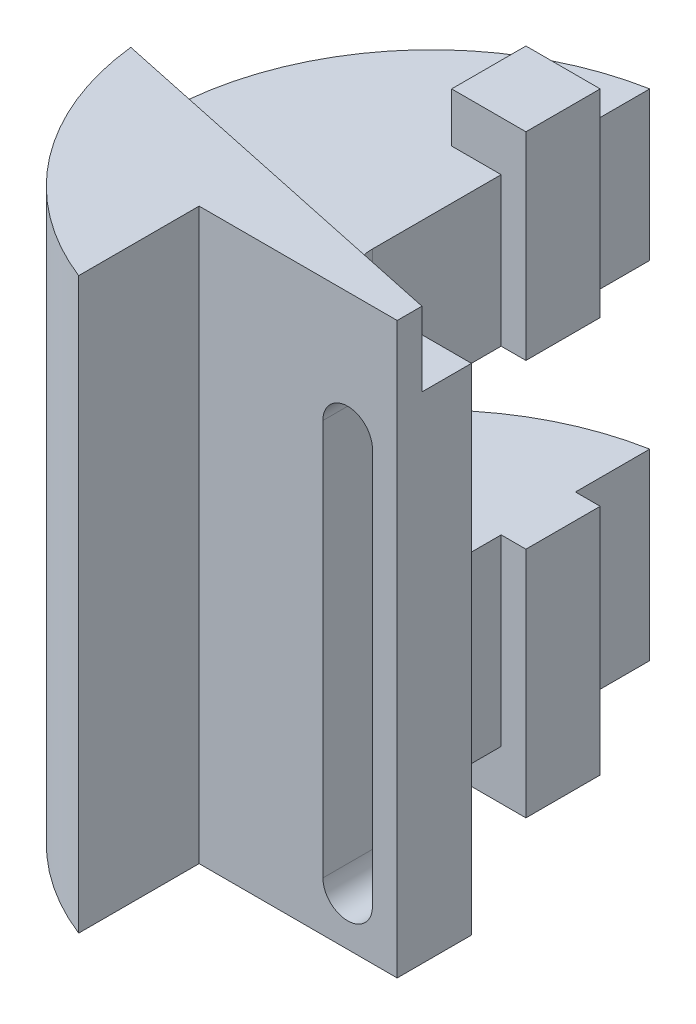
ISO-10303-21;
HEADER;
FILE_DESCRIPTION(('STEP AP214'),'2;1');
FILE_NAME('part.step','',(''),(''),'','','');
FILE_SCHEMA(('AUTOMOTIVE_DESIGN { 1 0 10303 214 1 1 1 1 }'));
ENDSEC;
DATA;
#1=APPLICATION_CONTEXT('core data for automotive mechanical design processes');
#2=APPLICATION_PROTOCOL_DEFINITION('international standard','automotive_design',2000,#1);
#3=PRODUCT_CONTEXT('',#1,'mechanical');
#4=PRODUCT('Part','Part','',(#3));
#5=PRODUCT_RELATED_PRODUCT_CATEGORY('part','',(#4));
#6=PRODUCT_DEFINITION_FORMATION('','',#4);
#7=PRODUCT_DEFINITION_CONTEXT('part definition',#1,'design');
#8=PRODUCT_DEFINITION('design','',#6,#7);
#9=PRODUCT_DEFINITION_SHAPE('','',#8);
#10=(LENGTH_UNIT() NAMED_UNIT(*) SI_UNIT(.MILLI.,.METRE.));
#11=(NAMED_UNIT(*) PLANE_ANGLE_UNIT() SI_UNIT($,.RADIAN.));
#12=(NAMED_UNIT(*) SI_UNIT($,.STERADIAN.) SOLID_ANGLE_UNIT());
#13=UNCERTAINTY_MEASURE_WITH_UNIT(LENGTH_MEASURE(1.E-05),#10,'distance_accuracy_value','');
#14=(GEOMETRIC_REPRESENTATION_CONTEXT(3) GLOBAL_UNCERTAINTY_ASSIGNED_CONTEXT((#13)) GLOBAL_UNIT_ASSIGNED_CONTEXT((#10,
#11,#12)) REPRESENTATION_CONTEXT('',''));
#15=CARTESIAN_POINT('',(0.,0.,0.));
#16=DIRECTION('',(0.,0.,1.));
#17=DIRECTION('',(1.,0.,0.));
#18=AXIS2_PLACEMENT_3D('',#15,#16,#17);
#19=CARTESIAN_POINT('',(0.,50.,0.));
#20=DIRECTION('',(0.,1.,0.));
#21=DIRECTION('',(0.,0.,1.));
#22=AXIS2_PLACEMENT_3D('',#19,#20,#21);
#23=PLANE('',#22);
#24=CARTESIAN_POINT('',(-20.,50.,-26.9167308680402));
#25=DIRECTION('',(0.,1.,0.));
#26=DIRECTION('',(0.,0.,1.));
#27=AXIS2_PLACEMENT_3D('',#24,#25,#26);
#28=CIRCLE('',#27,55.);
#29=CARTESIAN_POINT('',(-74.6666981663272,50.,-20.8708966334882));
#30=VERTEX_POINT('',#29);
#31=CARTESIAN_POINT('',(-30.,50.,-81.));
#32=VERTEX_POINT('',#31);
#33=EDGE_CURVE('E363',#30,#32,#28,.F.);
#34=ORIENTED_EDGE('',*,*,#33,.F.);
#35=DIRECTION('',(-0.978147600733805,0.,-0.207911690817763));
#36=VECTOR('',#35,1.);
#37=CARTESIAN_POINT('',(0.,50.,-5.));
#38=LINE('',#37,#36);
#39=CARTESIAN_POINT('',(0.,50.,-5.));
#40=VERTEX_POINT('',#39);
#41=EDGE_CURVE('E260',#40,#30,#38,.T.);
#42=ORIENTED_EDGE('',*,*,#41,.F.);
#43=DIRECTION('',(0.,0.,1.));
#44=VECTOR('',#43,1.);
#45=CARTESIAN_POINT('',(0.,50.,0.));
#46=LINE('',#45,#44);
#47=CARTESIAN_POINT('',(0.,50.,-15.));
#48=VERTEX_POINT('',#47);
#49=EDGE_CURVE('E365',#48,#40,#46,.T.);
#50=ORIENTED_EDGE('',*,*,#49,.F.);
#51=DIRECTION('',(1.,0.,0.));
#52=VECTOR('',#51,1.);
#53=CARTESIAN_POINT('',(0.,50.,-15.));
#54=LINE('',#53,#52);
#55=CARTESIAN_POINT('',(-19.9999999999999,50.,-15.));
#56=VERTEX_POINT('',#55);
#57=EDGE_CURVE('E368',#56,#48,#54,.T.);
#58=ORIENTED_EDGE('',*,*,#57,.F.);
#59=CARTESIAN_POINT('',(-20.,50.,-25.));
#60=DIRECTION('',(0.,1.,0.));
#61=DIRECTION('',(0.,0.,1.));
#62=AXIS2_PLACEMENT_3D('',#59,#60,#61);
#63=CIRCLE('',#62,10.);
#64=CARTESIAN_POINT('',(-30.,50.,-25.0000000000001));
#65=VERTEX_POINT('',#64);
#66=EDGE_CURVE('E348',#65,#56,#63,.T.);
#67=ORIENTED_EDGE('',*,*,#66,.F.);
#68=DIRECTION('',(0.,0.,1.));
#69=VECTOR('',#68,1.);
#70=CARTESIAN_POINT('',(-30.,50.,0.));
#71=LINE('',#70,#69);
#72=CARTESIAN_POINT('',(-30.,50.,-51.));
#73=VERTEX_POINT('',#72);
#74=EDGE_CURVE('E351',#73,#65,#71,.T.);
#75=ORIENTED_EDGE('',*,*,#74,.F.);
#76=DIRECTION('',(1.,0.,0.));
#77=VECTOR('',#76,1.);
#78=CARTESIAN_POINT('',(0.,50.,-51.));
#79=LINE('',#78,#77);
#80=CARTESIAN_POINT('',(-40.,50.,-51.));
#81=VERTEX_POINT('',#80);
#82=EDGE_CURVE('E355',#81,#73,#79,.T.);
#83=ORIENTED_EDGE('',*,*,#82,.F.);
#84=DIRECTION('',(0.,0.,1.));
#85=VECTOR('',#84,1.);
#86=CARTESIAN_POINT('',(-40.,50.,0.));
#87=LINE('',#86,#85);
#88=CARTESIAN_POINT('',(-40.,50.,-66.));
#89=VERTEX_POINT('',#88);
#90=EDGE_CURVE('E358',#89,#81,#87,.T.);
#91=ORIENTED_EDGE('',*,*,#90,.F.);
#92=DIRECTION('',(1.,0.,0.));
#93=VECTOR('',#92,1.);
#94=CARTESIAN_POINT('',(0.,50.,-66.));
#95=LINE('',#94,#93);
#96=CARTESIAN_POINT('',(-30.,50.,-66.));
#97=VERTEX_POINT('',#96);
#98=EDGE_CURVE('E360',#89,#97,#95,.T.);
#99=ORIENTED_EDGE('',*,*,#98,.T.);
#100=EDGE_CURVE('E356',#32,#97,#71,.T.);
#101=ORIENTED_EDGE('',*,*,#100,.F.);
#102=EDGE_LOOP('',(#34,#42,#50,#58,#67,#75,#83,#91,#99,#101));
#103=FACE_BOUND('',#102,.T.);
#104=ADVANCED_FACE('F41',(#103),#23,.T.);
#105=CARTESIAN_POINT('',(-30.,50.,0.));
#106=DIRECTION('',(1.,0.,0.));
#107=DIRECTION('',(0.,0.,-1.));
#108=AXIS2_PLACEMENT_3D('',#105,#106,#107);
#109=PLANE('',#108);
#110=DIRECTION('',(0.,0.,1.));
#111=VECTOR('',#110,1.);
#112=CARTESIAN_POINT('',(-30.,20.,0.));
#113=LINE('',#112,#111);
#114=CARTESIAN_POINT('',(-30.,20.,-81.));
#115=VERTEX_POINT('',#114);
#116=CARTESIAN_POINT('',(-30.,20.,-66.));
#117=VERTEX_POINT('',#116);
#118=EDGE_CURVE('E303',#115,#117,#113,.T.);
#119=ORIENTED_EDGE('',*,*,#118,.F.);
#120=DIRECTION('',(0.,-1.,0.));
#121=VECTOR('',#120,1.);
#122=CARTESIAN_POINT('',(-30.,50.,-81.));
#123=LINE('',#122,#121);
#124=EDGE_CURVE('E411',#32,#115,#123,.T.);
#125=ORIENTED_EDGE('',*,*,#124,.F.);
#126=ORIENTED_EDGE('',*,*,#100,.T.);
#127=DIRECTION('',(0.,-1.,0.));
#128=VECTOR('',#127,1.);
#129=CARTESIAN_POINT('',(-30.,50.,-66.));
#130=LINE('',#129,#128);
#131=EDGE_CURVE('E415',#97,#117,#130,.T.);
#132=ORIENTED_EDGE('',*,*,#131,.T.);
#133=EDGE_LOOP('',(#119,#125,#126,#132));
#134=FACE_BOUND('',#133,.T.);
#135=ADVANCED_FACE('F475',(#134),#109,.T.);
#136=CARTESIAN_POINT('',(-25.,60.,0.));
#137=DIRECTION('',(1.,0.,0.));
#138=DIRECTION('',(0.,0.,-1.));
#139=AXIS2_PLACEMENT_3D('',#136,#137,#138);
#140=PLANE('',#139);
#141=DIRECTION('',(0.,0.,1.));
#142=VECTOR('',#141,1.);
#143=CARTESIAN_POINT('',(-25.,20.,0.));
#144=LINE('',#143,#142);
#145=CARTESIAN_POINT('',(-25.,20.,-66.));
#146=VERTEX_POINT('',#145);
#147=CARTESIAN_POINT('',(-25.,20.,-51.));
#148=VERTEX_POINT('',#147);
#149=EDGE_CURVE('E297',#146,#148,#144,.T.);
#150=ORIENTED_EDGE('',*,*,#149,.F.);
#151=DIRECTION('',(0.,-1.,0.));
#152=VECTOR('',#151,1.);
#153=CARTESIAN_POINT('',(-25.,60.,-66.));
#154=LINE('',#153,#152);
#155=CARTESIAN_POINT('',(-25.,60.,-66.));
#156=VERTEX_POINT('',#155);
#157=EDGE_CURVE('E344',#156,#146,#154,.T.);
#158=ORIENTED_EDGE('',*,*,#157,.F.);
#159=DIRECTION('',(0.,0.,1.));
#160=VECTOR('',#159,1.);
#161=CARTESIAN_POINT('',(-25.,60.,0.));
#162=LINE('',#161,#160);
#163=CARTESIAN_POINT('',(-25.,60.,-51.));
#164=VERTEX_POINT('',#163);
#165=EDGE_CURVE('E310',#156,#164,#162,.T.);
#166=ORIENTED_EDGE('',*,*,#165,.T.);
#167=DIRECTION('',(0.,-1.,0.));
#168=VECTOR('',#167,1.);
#169=CARTESIAN_POINT('',(-25.,60.,-51.));
#170=LINE('',#169,#168);
#171=EDGE_CURVE('E332',#164,#148,#170,.T.);
#172=ORIENTED_EDGE('',*,*,#171,.T.);
#173=EDGE_LOOP('',(#150,#158,#166,#172));
#174=FACE_BOUND('',#173,.T.);
#175=ADVANCED_FACE('F436',(#174),#140,.T.);
#176=CARTESIAN_POINT('',(0.,60.,-66.));
#177=DIRECTION('',(0.,0.,-1.));
#178=DIRECTION('',(-1.,0.,0.));
#179=AXIS2_PLACEMENT_3D('',#176,#177,#178);
#180=PLANE('',#179);
#181=DIRECTION('',(1.,0.,0.));
#182=VECTOR('',#181,1.);
#183=CARTESIAN_POINT('',(0.,20.,-66.));
#184=LINE('',#183,#182);
#185=EDGE_CURVE('E301',#117,#146,#184,.T.);
#186=ORIENTED_EDGE('',*,*,#185,.F.);
#187=ORIENTED_EDGE('',*,*,#131,.F.);
#188=ORIENTED_EDGE('',*,*,#98,.F.);
#189=DIRECTION('',(0.,-1.,0.));
#190=VECTOR('',#189,1.);
#191=CARTESIAN_POINT('',(-40.,60.,-66.));
#192=LINE('',#191,#190);
#193=CARTESIAN_POINT('',(-40.,60.,-66.));
#194=VERTEX_POINT('',#193);
#195=EDGE_CURVE('E340',#194,#89,#192,.T.);
#196=ORIENTED_EDGE('',*,*,#195,.F.);
#197=DIRECTION('',(1.,0.,0.));
#198=VECTOR('',#197,1.);
#199=CARTESIAN_POINT('',(0.,60.,-66.));
#200=LINE('',#199,#198);
#201=EDGE_CURVE('E313',#194,#156,#200,.T.);
#202=ORIENTED_EDGE('',*,*,#201,.T.);
#203=ORIENTED_EDGE('',*,*,#157,.T.);
#204=EDGE_LOOP('',(#186,#187,#188,#196,#202,#203));
#205=FACE_BOUND('',#204,.T.);
#206=ADVANCED_FACE('F443',(#205),#180,.T.);
#207=CARTESIAN_POINT('',(0.,60.,-51.));
#208=DIRECTION('',(0.,0.,-1.));
#209=DIRECTION('',(-1.,0.,0.));
#210=AXIS2_PLACEMENT_3D('',#207,#208,#209);
#211=PLANE('',#210);
#212=DIRECTION('',(0.,-1.,0.));
#213=VECTOR('',#212,1.);
#214=CARTESIAN_POINT('',(-30.,50.,-51.));
#215=LINE('',#214,#213);
#216=CARTESIAN_POINT('',(-30.,20.,-51.));
#217=VERTEX_POINT('',#216);
#218=EDGE_CURVE('E419',#73,#217,#215,.T.);
#219=ORIENTED_EDGE('',*,*,#218,.T.);
#220=DIRECTION('',(1.,0.,0.));
#221=VECTOR('',#220,1.);
#222=CARTESIAN_POINT('',(0.,20.,-51.));
#223=LINE('',#222,#221);
#224=EDGE_CURVE('E49',#217,#148,#223,.T.);
#225=ORIENTED_EDGE('',*,*,#224,.T.);
#226=ORIENTED_EDGE('',*,*,#171,.F.);
#227=DIRECTION('',(1.,0.,0.));
#228=VECTOR('',#227,1.);
#229=CARTESIAN_POINT('',(0.,60.,-51.));
#230=LINE('',#229,#228);
#231=CARTESIAN_POINT('',(-40.,60.,-51.));
#232=VERTEX_POINT('',#231);
#233=EDGE_CURVE('E319',#232,#164,#230,.T.);
#234=ORIENTED_EDGE('',*,*,#233,.F.);
#235=DIRECTION('',(0.,-1.,0.));
#236=VECTOR('',#235,1.);
#237=CARTESIAN_POINT('',(-40.,60.,-51.));
#238=LINE('',#237,#236);
#239=EDGE_CURVE('E336',#232,#81,#238,.T.);
#240=ORIENTED_EDGE('',*,*,#239,.T.);
#241=ORIENTED_EDGE('',*,*,#82,.T.);
#242=EDGE_LOOP('',(#219,#225,#226,#234,#240,#241));
#243=FACE_BOUND('',#242,.T.);
#244=ADVANCED_FACE('F429',(#243),#211,.F.);
#245=CARTESIAN_POINT('',(-20.,50.,-25.));
#246=DIRECTION('',(0.,-1.,0.));
#247=DIRECTION('',(0.,0.,-1.));
#248=AXIS2_PLACEMENT_3D('',#245,#246,#247);
#249=CYLINDRICAL_SURFACE('',#248,10.);
#250=CARTESIAN_POINT('',(-20.,-50.,-25.));
#251=DIRECTION('',(0.,1.,0.));
#252=DIRECTION('',(0.,0.,1.));
#253=AXIS2_PLACEMENT_3D('',#250,#251,#252);
#254=CIRCLE('',#253,10.);
#255=CARTESIAN_POINT('',(-30.,-50.,-25.0000000000001));
#256=VERTEX_POINT('',#255);
#257=CARTESIAN_POINT('',(-19.9999999999999,-50.,-15.));
#258=VERTEX_POINT('',#257);
#259=EDGE_CURVE('E347',#256,#258,#254,.T.);
#260=ORIENTED_EDGE('',*,*,#259,.F.);
#261=DIRECTION('',(0.,-1.,0.));
#262=VECTOR('',#261,1.);
#263=CARTESIAN_POINT('',(-30.,50.,-25.0000000000001));
#264=LINE('',#263,#262);
#265=EDGE_CURVE('E422',#65,#256,#264,.T.);
#266=ORIENTED_EDGE('',*,*,#265,.F.);
#267=ORIENTED_EDGE('',*,*,#66,.T.);
#268=DIRECTION('',(0.,-1.,0.));
#269=VECTOR('',#268,1.);
#270=CARTESIAN_POINT('',(-19.9999999999999,50.,-15.));
#271=LINE('',#270,#269);
#272=EDGE_CURVE('E371',#56,#258,#271,.T.);
#273=ORIENTED_EDGE('',*,*,#272,.T.);
#274=EDGE_LOOP('',(#260,#266,#267,#273));
#275=FACE_BOUND('',#274,.T.);
#276=ADVANCED_FACE('F43',(#275),#249,.F.);
#277=DIRECTION('',(0.,0.,1.));
#278=VECTOR('',#277,1.);
#279=CARTESIAN_POINT('',(-30.,20.,0.));
#280=LINE('',#279,#278);
#281=CARTESIAN_POINT('',(-30.,20.,-41.));
#282=VERTEX_POINT('',#281);
#283=EDGE_CURVE('E299',#217,#282,#280,.T.);
#284=ORIENTED_EDGE('',*,*,#283,.F.);
#285=ORIENTED_EDGE('',*,*,#218,.F.);
#286=ORIENTED_EDGE('',*,*,#74,.T.);
#287=ORIENTED_EDGE('',*,*,#265,.T.);
#288=DIRECTION('',(0.,0.,1.));
#289=VECTOR('',#288,1.);
#290=CARTESIAN_POINT('',(-30.,-50.,0.));
#291=LINE('',#290,#289);
#292=CARTESIAN_POINT('',(-30.,-50.,-51.));
#293=VERTEX_POINT('',#292);
#294=EDGE_CURVE('E374',#293,#256,#291,.T.);
#295=ORIENTED_EDGE('',*,*,#294,.F.);
#296=CARTESIAN_POINT('',(-30.,-13.,-51.));
#297=VERTEX_POINT('',#296);
#298=EDGE_CURVE('E418',#297,#293,#215,.T.);
#299=ORIENTED_EDGE('',*,*,#298,.F.);
#300=DIRECTION('',(0.,0.,-1.));
#301=VECTOR('',#300,1.);
#302=CARTESIAN_POINT('',(-30.,-13.,0.));
#303=LINE('',#302,#301);
#304=CARTESIAN_POINT('',(-30.,-13.,-41.));
#305=VERTEX_POINT('',#304);
#306=EDGE_CURVE('E289',#305,#297,#303,.T.);
#307=ORIENTED_EDGE('',*,*,#306,.F.);
#308=DIRECTION('',(0.,-1.,0.));
#309=VECTOR('',#308,1.);
#310=CARTESIAN_POINT('',(-30.,50.,-41.));
#311=LINE('',#310,#309);
#312=EDGE_CURVE('E307',#282,#305,#311,.T.);
#313=ORIENTED_EDGE('',*,*,#312,.F.);
#314=EDGE_LOOP('',(#284,#285,#286,#287,#295,#299,#307,#313));
#315=FACE_BOUND('',#314,.T.);
#316=ADVANCED_FACE('F456',(#315),#109,.T.);
#317=DIRECTION('',(0.,0.,-1.));
#318=VECTOR('',#317,1.);
#319=CARTESIAN_POINT('',(-30.,-13.,0.));
#320=LINE('',#319,#318);
#321=CARTESIAN_POINT('',(-30.,-13.,-66.));
#322=VERTEX_POINT('',#321);
#323=CARTESIAN_POINT('',(-30.,-13.,-81.));
#324=VERTEX_POINT('',#323);
#325=EDGE_CURVE('E293',#322,#324,#320,.T.);
#326=ORIENTED_EDGE('',*,*,#325,.F.);
#327=CARTESIAN_POINT('',(-30.,-50.,-66.));
#328=VERTEX_POINT('',#327);
#329=EDGE_CURVE('E414',#322,#328,#130,.T.);
#330=ORIENTED_EDGE('',*,*,#329,.T.);
#331=CARTESIAN_POINT('',(-30.,-50.,-81.));
#332=VERTEX_POINT('',#331);
#333=EDGE_CURVE('E378',#332,#328,#291,.T.);
#334=ORIENTED_EDGE('',*,*,#333,.F.);
#335=EDGE_CURVE('E410',#324,#332,#123,.T.);
#336=ORIENTED_EDGE('',*,*,#335,.F.);
#337=EDGE_LOOP('',(#326,#330,#334,#336));
#338=FACE_BOUND('',#337,.T.);
#339=ADVANCED_FACE('F513',(#338),#109,.T.);
#340=CARTESIAN_POINT('',(-20.,50.,-26.9167308680402));
#341=DIRECTION('',(0.,-1.,0.));
#342=DIRECTION('',(0.,0.,-1.));
#343=AXIS2_PLACEMENT_3D('',#340,#341,#342);
#344=CYLINDRICAL_SURFACE('',#343,55.);
#345=CARTESIAN_POINT('',(-20.,20.,-26.9167308680402));
#346=DIRECTION('',(0.,1.,0.));
#347=DIRECTION('',(0.,0.,1.));
#348=AXIS2_PLACEMENT_3D('',#345,#346,#347);
#349=CIRCLE('',#348,55.);
#350=CARTESIAN_POINT('',(-73.166357130772,20.,-41.));
#351=VERTEX_POINT('',#350);
#352=EDGE_CURVE('E305',#351,#115,#349,.F.);
#353=ORIENTED_EDGE('',*,*,#352,.F.);
#354=DIRECTION('',(0.,-1.,0.));
#355=VECTOR('',#354,1.);
#356=CARTESIAN_POINT('',(-73.166357130772,50.,-41.));
#357=LINE('',#356,#355);
#358=CARTESIAN_POINT('',(-73.166357130772,-13.,-41.));
#359=VERTEX_POINT('',#358);
#360=EDGE_CURVE('E11',#359,#351,#357,.F.);
#361=ORIENTED_EDGE('',*,*,#360,.F.);
#362=CARTESIAN_POINT('',(-20.,-13.,-26.9167308680402));
#363=DIRECTION('',(0.,-1.,0.));
#364=DIRECTION('',(0.,0.,-1.));
#365=AXIS2_PLACEMENT_3D('',#362,#363,#364);
#366=CIRCLE('',#365,55.);
#367=EDGE_CURVE('E295',#324,#359,#366,.F.);
#368=ORIENTED_EDGE('',*,*,#367,.F.);
#369=ORIENTED_EDGE('',*,*,#335,.T.);
#370=CARTESIAN_POINT('',(-20.,-50.,-26.9167308680402));
#371=DIRECTION('',(0.,1.,0.));
#372=DIRECTION('',(0.,0.,1.));
#373=AXIS2_PLACEMENT_3D('',#370,#371,#372);
#374=CIRCLE('',#373,55.);
#375=CARTESIAN_POINT('',(-40.,-50.,24.3180229617578));
#376=VERTEX_POINT('',#375);
#377=EDGE_CURVE('E387',#376,#332,#374,.F.);
#378=ORIENTED_EDGE('',*,*,#377,.F.);
#379=DIRECTION('',(0.,-1.,0.));
#380=VECTOR('',#379,1.);
#381=CARTESIAN_POINT('',(-40.,50.,24.3180229617578));
#382=LINE('',#381,#380);
#383=CARTESIAN_POINT('',(-40.,65.,24.3180229617578));
#384=VERTEX_POINT('',#383);
#385=EDGE_CURVE('E408',#384,#376,#382,.T.);
#386=ORIENTED_EDGE('',*,*,#385,.F.);
#387=CARTESIAN_POINT('',(-19.9999999999968,65.,-26.9167308680426));
#388=DIRECTION('',(0.,1.,0.));
#389=DIRECTION('',(0.,0.,1.));
#390=AXIS2_PLACEMENT_3D('',#387,#388,#389);
#391=CIRCLE('',#390,55.0000000000035);
#392=CARTESIAN_POINT('',(-74.6666981663272,65.,-20.8708966334882));
#393=VERTEX_POINT('',#392);
#394=EDGE_CURVE('E266',#393,#384,#391,.T.);
#395=ORIENTED_EDGE('',*,*,#394,.F.);
#396=DIRECTION('',(0.,-1.,0.));
#397=VECTOR('',#396,1.);
#398=CARTESIAN_POINT('',(-74.6666981663272,65.,-20.8708966334882));
#399=LINE('',#398,#397);
#400=EDGE_CURVE('E275',#393,#30,#399,.T.);
#401=ORIENTED_EDGE('',*,*,#400,.T.);
#402=ORIENTED_EDGE('',*,*,#33,.T.);
#403=ORIENTED_EDGE('',*,*,#124,.T.);
#404=EDGE_LOOP('',(#353,#361,#368,#369,#378,#386,#395,#401,#402,#403));
#405=FACE_BOUND('',#404,.T.);
#406=ADVANCED_FACE('F470',(#405),#344,.T.);
#407=CARTESIAN_POINT('',(-40.,50.,0.));
#408=DIRECTION('',(1.,0.,0.));
#409=DIRECTION('',(0.,0.,-1.));
#410=AXIS2_PLACEMENT_3D('',#407,#408,#409);
#411=PLANE('',#410);
#412=DIRECTION('',(0.,0.,1.));
#413=VECTOR('',#412,1.);
#414=CARTESIAN_POINT('',(-40.,-50.,0.));
#415=LINE('',#414,#413);
#416=CARTESIAN_POINT('',(-40.,-50.,0.));
#417=VERTEX_POINT('',#416);
#418=EDGE_CURVE('E390',#417,#376,#415,.T.);
#419=ORIENTED_EDGE('',*,*,#418,.F.);
#420=DIRECTION('',(0.,-1.,0.));
#421=VECTOR('',#420,1.);
#422=CARTESIAN_POINT('',(-40.,50.,0.));
#423=LINE('',#422,#421);
#424=CARTESIAN_POINT('',(-40.,65.,0.));
#425=VERTEX_POINT('',#424);
#426=EDGE_CURVE('E406',#425,#417,#423,.T.);
#427=ORIENTED_EDGE('',*,*,#426,.F.);
#428=DIRECTION('',(0.,0.,-1.));
#429=VECTOR('',#428,1.);
#430=CARTESIAN_POINT('',(-40.,65.,0.));
#431=LINE('',#430,#429);
#432=EDGE_CURVE('E269',#384,#425,#431,.T.);
#433=ORIENTED_EDGE('',*,*,#432,.F.);
#434=ORIENTED_EDGE('',*,*,#385,.T.);
#435=EDGE_LOOP('',(#419,#427,#433,#434));
#436=FACE_BOUND('',#435,.T.);
#437=ADVANCED_FACE('F520',(#436),#411,.T.);
#438=CARTESIAN_POINT('',(0.,50.,0.));
#439=DIRECTION('',(0.,0.,1.));
#440=DIRECTION('',(1.,0.,0.));
#441=AXIS2_PLACEMENT_3D('',#438,#439,#440);
#442=PLANE('',#441);
#443=CARTESIAN_POINT('',(-9.99999999999999,40.,0.));
#444=DIRECTION('',(0.,0.,1.));
#445=DIRECTION('',(1.,0.,0.));
#446=AXIS2_PLACEMENT_3D('',#443,#444,#445);
#447=CIRCLE('',#446,5.);
#448=CARTESIAN_POINT('',(-4.99999999999999,40.,0.));
#449=VERTEX_POINT('',#448);
#450=CARTESIAN_POINT('',(-15.,40.,0.));
#451=VERTEX_POINT('',#450);
#452=EDGE_CURVE('E258',#449,#451,#447,.T.);
#453=ORIENTED_EDGE('',*,*,#452,.F.);
#454=DIRECTION('',(0.,1.,0.));
#455=VECTOR('',#454,1.);
#456=CARTESIAN_POINT('',(-4.99999999999999,50.,0.));
#457=LINE('',#456,#455);
#458=CARTESIAN_POINT('',(-4.99999999999999,-40.,0.));
#459=VERTEX_POINT('',#458);
#460=EDGE_CURVE('E251',#459,#449,#457,.T.);
#461=ORIENTED_EDGE('',*,*,#460,.F.);
#462=CARTESIAN_POINT('',(-9.99999999999999,-40.,0.));
#463=DIRECTION('',(0.,0.,1.));
#464=DIRECTION('',(1.,0.,0.));
#465=AXIS2_PLACEMENT_3D('',#462,#463,#464);
#466=CIRCLE('',#465,5.);
#467=CARTESIAN_POINT('',(-15.,-40.,0.));
#468=VERTEX_POINT('',#467);
#469=EDGE_CURVE('E231',#468,#459,#466,.T.);
#470=ORIENTED_EDGE('',*,*,#469,.F.);
#471=DIRECTION('',(0.,-1.,0.));
#472=VECTOR('',#471,1.);
#473=CARTESIAN_POINT('',(-15.,50.,0.));
#474=LINE('',#473,#472);
#475=EDGE_CURVE('E256',#451,#468,#474,.T.);
#476=ORIENTED_EDGE('',*,*,#475,.F.);
#477=EDGE_LOOP('',(#453,#461,#470,#476));
#478=FACE_BOUND('',#477,.T.);
#479=DIRECTION('',(-1.,0.,0.));
#480=VECTOR('',#479,1.);
#481=CARTESIAN_POINT('',(0.,-50.,0.));
#482=LINE('',#481,#480);
#483=CARTESIAN_POINT('',(0.,-50.,0.));
#484=VERTEX_POINT('',#483);
#485=EDGE_CURVE('E393',#484,#417,#482,.T.);
#486=ORIENTED_EDGE('',*,*,#485,.F.);
#487=DIRECTION('',(0.,-1.,0.));
#488=VECTOR('',#487,1.);
#489=CARTESIAN_POINT('',(0.,50.,0.));
#490=LINE('',#489,#488);
#491=CARTESIAN_POINT('',(0.,65.,0.));
#492=VERTEX_POINT('',#491);
#493=EDGE_CURVE('E404',#492,#484,#490,.T.);
#494=ORIENTED_EDGE('',*,*,#493,.F.);
#495=DIRECTION('',(1.,0.,0.));
#496=VECTOR('',#495,1.);
#497=CARTESIAN_POINT('',(0.,65.,0.));
#498=LINE('',#497,#496);
#499=EDGE_CURVE('E272',#425,#492,#498,.T.);
#500=ORIENTED_EDGE('',*,*,#499,.F.);
#501=ORIENTED_EDGE('',*,*,#426,.T.);
#502=EDGE_LOOP('',(#486,#494,#500,#501));
#503=FACE_BOUND('',#502,.T.);
#504=ADVANCED_FACE('F526',(#478,#503),#442,.T.);
#505=CARTESIAN_POINT('',(0.,50.,0.));
#506=DIRECTION('',(1.,0.,0.));
#507=DIRECTION('',(0.,0.,-1.));
#508=AXIS2_PLACEMENT_3D('',#505,#506,#507);
#509=PLANE('',#508);
#510=DIRECTION('',(0.,0.,1.));
#511=VECTOR('',#510,1.);
#512=CARTESIAN_POINT('',(0.,-50.,0.));
#513=LINE('',#512,#511);
#514=CARTESIAN_POINT('',(0.,-50.,-15.));
#515=VERTEX_POINT('',#514);
#516=EDGE_CURVE('E396',#515,#484,#513,.T.);
#517=ORIENTED_EDGE('',*,*,#516,.F.);
#518=DIRECTION('',(0.,-1.,0.));
#519=VECTOR('',#518,1.);
#520=CARTESIAN_POINT('',(0.,50.,-15.));
#521=LINE('',#520,#519);
#522=EDGE_CURVE('E402',#48,#515,#521,.T.);
#523=ORIENTED_EDGE('',*,*,#522,.F.);
#524=ORIENTED_EDGE('',*,*,#49,.T.);
#525=DIRECTION('',(0.,-1.,0.));
#526=VECTOR('',#525,1.);
#527=CARTESIAN_POINT('',(0.,65.,-5.));
#528=LINE('',#527,#526);
#529=CARTESIAN_POINT('',(0.,65.,-5.));
#530=VERTEX_POINT('',#529);
#531=EDGE_CURVE('E279',#530,#40,#528,.T.);
#532=ORIENTED_EDGE('',*,*,#531,.F.);
#533=DIRECTION('',(0.,0.,-1.));
#534=VECTOR('',#533,1.);
#535=CARTESIAN_POINT('',(0.,65.,-5.));
#536=LINE('',#535,#534);
#537=EDGE_CURVE('E261',#492,#530,#536,.T.);
#538=ORIENTED_EDGE('',*,*,#537,.F.);
#539=ORIENTED_EDGE('',*,*,#493,.T.);
#540=EDGE_LOOP('',(#517,#523,#524,#532,#538,#539));
#541=FACE_BOUND('',#540,.T.);
#542=ADVANCED_FACE('F488',(#541),#509,.T.);
#543=CARTESIAN_POINT('',(0.,50.,-15.));
#544=DIRECTION('',(0.,0.,-1.));
#545=DIRECTION('',(-1.,0.,0.));
#546=AXIS2_PLACEMENT_3D('',#543,#544,#545);
#547=PLANE('',#546);
#548=CARTESIAN_POINT('',(-9.99999999999999,40.,-15.));
#549=DIRECTION('',(0.,0.,-1.));
#550=DIRECTION('',(-1.,0.,0.));
#551=AXIS2_PLACEMENT_3D('',#548,#549,#550);
#552=CIRCLE('',#551,5.);
#553=CARTESIAN_POINT('',(-15.,40.,-15.));
#554=VERTEX_POINT('',#553);
#555=CARTESIAN_POINT('',(-4.99999999999999,40.,-15.));
#556=VERTEX_POINT('',#555);
#557=EDGE_CURVE('E64',#554,#556,#552,.T.);
#558=ORIENTED_EDGE('',*,*,#557,.F.);
#559=DIRECTION('',(0.,1.,0.));
#560=VECTOR('',#559,1.);
#561=CARTESIAN_POINT('',(-15.,40.,-15.));
#562=LINE('',#561,#560);
#563=CARTESIAN_POINT('',(-15.,-40.,-15.));
#564=VERTEX_POINT('',#563);
#565=EDGE_CURVE('E244',#564,#554,#562,.T.);
#566=ORIENTED_EDGE('',*,*,#565,.F.);
#567=CARTESIAN_POINT('',(-9.99999999999999,-40.,-15.));
#568=DIRECTION('',(0.,0.,-1.));
#569=DIRECTION('',(-1.,0.,0.));
#570=AXIS2_PLACEMENT_3D('',#567,#568,#569);
#571=CIRCLE('',#570,5.);
#572=CARTESIAN_POINT('',(-4.99999999999999,-40.,-15.));
#573=VERTEX_POINT('',#572);
#574=EDGE_CURVE('E228',#573,#564,#571,.T.);
#575=ORIENTED_EDGE('',*,*,#574,.F.);
#576=DIRECTION('',(0.,-1.,0.));
#577=VECTOR('',#576,1.);
#578=CARTESIAN_POINT('',(-4.99999999999999,40.,-15.));
#579=LINE('',#578,#577);
#580=EDGE_CURVE('E237',#556,#573,#579,.T.);
#581=ORIENTED_EDGE('',*,*,#580,.F.);
#582=EDGE_LOOP('',(#558,#566,#575,#581));
#583=FACE_BOUND('',#582,.T.);
#584=DIRECTION('',(1.,0.,0.));
#585=VECTOR('',#584,1.);
#586=CARTESIAN_POINT('',(0.,-50.,-15.));
#587=LINE('',#586,#585);
#588=EDGE_CURVE('E352',#258,#515,#587,.T.);
#589=ORIENTED_EDGE('',*,*,#588,.F.);
#590=ORIENTED_EDGE('',*,*,#272,.F.);
#591=ORIENTED_EDGE('',*,*,#57,.T.);
#592=ORIENTED_EDGE('',*,*,#522,.T.);
#593=EDGE_LOOP('',(#589,#590,#591,#592));
#594=FACE_BOUND('',#593,.T.);
#595=ADVANCED_FACE('F241',(#583,#594),#547,.T.);
#596=CARTESIAN_POINT('',(0.,-50.,0.));
#597=DIRECTION('',(0.,1.,0.));
#598=DIRECTION('',(0.,0.,1.));
#599=AXIS2_PLACEMENT_3D('',#596,#597,#598);
#600=PLANE('',#599);
#601=ORIENTED_EDGE('',*,*,#259,.T.);
#602=ORIENTED_EDGE('',*,*,#588,.T.);
#603=ORIENTED_EDGE('',*,*,#516,.T.);
#604=ORIENTED_EDGE('',*,*,#485,.T.);
#605=ORIENTED_EDGE('',*,*,#418,.T.);
#606=ORIENTED_EDGE('',*,*,#377,.T.);
#607=ORIENTED_EDGE('',*,*,#333,.T.);
#608=DIRECTION('',(1.,0.,0.));
#609=VECTOR('',#608,1.);
#610=CARTESIAN_POINT('',(0.,-50.,-66.));
#611=LINE('',#610,#609);
#612=CARTESIAN_POINT('',(-40.,-50.,-66.));
#613=VERTEX_POINT('',#612);
#614=EDGE_CURVE('E384',#613,#328,#611,.T.);
#615=ORIENTED_EDGE('',*,*,#614,.F.);
#616=DIRECTION('',(0.,0.,1.));
#617=VECTOR('',#616,1.);
#618=CARTESIAN_POINT('',(-40.,-50.,0.));
#619=LINE('',#618,#617);
#620=CARTESIAN_POINT('',(-40.,-50.,-51.));
#621=VERTEX_POINT('',#620);
#622=EDGE_CURVE('E381',#613,#621,#619,.T.);
#623=ORIENTED_EDGE('',*,*,#622,.T.);
#624=DIRECTION('',(1.,0.,0.));
#625=VECTOR('',#624,1.);
#626=CARTESIAN_POINT('',(0.,-50.,-51.));
#627=LINE('',#626,#625);
#628=EDGE_CURVE('E377',#621,#293,#627,.T.);
#629=ORIENTED_EDGE('',*,*,#628,.T.);
#630=ORIENTED_EDGE('',*,*,#294,.T.);
#631=EDGE_LOOP('',(#601,#602,#603,#604,#605,#606,#607,#615,#623,#629,#630));
#632=FACE_BOUND('',#631,.T.);
#633=ADVANCED_FACE('F492',(#632),#600,.F.);
#634=CARTESIAN_POINT('',(-40.,60.,0.));
#635=DIRECTION('',(1.,0.,0.));
#636=DIRECTION('',(0.,0.,-1.));
#637=AXIS2_PLACEMENT_3D('',#634,#635,#636);
#638=PLANE('',#637);
#639=CARTESIAN_POINT('',(-40.,-60.,-51.));
#640=VERTEX_POINT('',#639);
#641=EDGE_CURVE('E335',#621,#640,#238,.T.);
#642=ORIENTED_EDGE('',*,*,#641,.F.);
#643=ORIENTED_EDGE('',*,*,#622,.F.);
#644=CARTESIAN_POINT('',(-40.,-60.,-66.));
#645=VERTEX_POINT('',#644);
#646=EDGE_CURVE('E339',#613,#645,#192,.T.);
#647=ORIENTED_EDGE('',*,*,#646,.T.);
#648=DIRECTION('',(0.,0.,1.));
#649=VECTOR('',#648,1.);
#650=CARTESIAN_POINT('',(-40.,-60.,0.));
#651=LINE('',#650,#649);
#652=EDGE_CURVE('E327',#645,#640,#651,.T.);
#653=ORIENTED_EDGE('',*,*,#652,.T.);
#654=EDGE_LOOP('',(#642,#643,#647,#653));
#655=FACE_BOUND('',#654,.T.);
#656=ADVANCED_FACE('F547',(#655),#638,.F.);
#657=DIRECTION('',(0.,0.,-1.));
#658=VECTOR('',#657,1.);
#659=CARTESIAN_POINT('',(-25.,-13.,0.));
#660=LINE('',#659,#658);
#661=CARTESIAN_POINT('',(-25.,-13.,-51.));
#662=VERTEX_POINT('',#661);
#663=CARTESIAN_POINT('',(-25.,-13.,-66.));
#664=VERTEX_POINT('',#663);
#665=EDGE_CURVE('E285',#662,#664,#660,.T.);
#666=ORIENTED_EDGE('',*,*,#665,.F.);
#667=CARTESIAN_POINT('',(-25.,-60.,-51.));
#668=VERTEX_POINT('',#667);
#669=EDGE_CURVE('E321',#662,#668,#170,.T.);
#670=ORIENTED_EDGE('',*,*,#669,.T.);
#671=DIRECTION('',(0.,0.,1.));
#672=VECTOR('',#671,1.);
#673=CARTESIAN_POINT('',(-25.,-60.,0.));
#674=LINE('',#673,#672);
#675=CARTESIAN_POINT('',(-25.,-60.,-66.));
#676=VERTEX_POINT('',#675);
#677=EDGE_CURVE('E309',#676,#668,#674,.T.);
#678=ORIENTED_EDGE('',*,*,#677,.F.);
#679=EDGE_CURVE('E343',#664,#676,#154,.T.);
#680=ORIENTED_EDGE('',*,*,#679,.F.);
#681=EDGE_LOOP('',(#666,#670,#678,#680));
#682=FACE_BOUND('',#681,.T.);
#683=ADVANCED_FACE('F504',(#682),#140,.T.);
#684=DIRECTION('',(-1.,0.,0.));
#685=VECTOR('',#684,1.);
#686=CARTESIAN_POINT('',(0.,-13.,-66.));
#687=LINE('',#686,#685);
#688=EDGE_CURVE('E291',#664,#322,#687,.T.);
#689=ORIENTED_EDGE('',*,*,#688,.F.);
#690=ORIENTED_EDGE('',*,*,#679,.T.);
#691=DIRECTION('',(1.,0.,0.));
#692=VECTOR('',#691,1.);
#693=CARTESIAN_POINT('',(0.,-60.,-66.));
#694=LINE('',#693,#692);
#695=EDGE_CURVE('E324',#645,#676,#694,.T.);
#696=ORIENTED_EDGE('',*,*,#695,.F.);
#697=ORIENTED_EDGE('',*,*,#646,.F.);
#698=ORIENTED_EDGE('',*,*,#614,.T.);
#699=ORIENTED_EDGE('',*,*,#329,.F.);
#700=EDGE_LOOP('',(#689,#690,#696,#697,#698,#699));
#701=FACE_BOUND('',#700,.T.);
#702=ADVANCED_FACE('F508',(#701),#180,.T.);
#703=ORIENTED_EDGE('',*,*,#90,.T.);
#704=ORIENTED_EDGE('',*,*,#239,.F.);
#705=DIRECTION('',(0.,0.,1.));
#706=VECTOR('',#705,1.);
#707=CARTESIAN_POINT('',(-40.,60.,0.));
#708=LINE('',#707,#706);
#709=EDGE_CURVE('E317',#194,#232,#708,.T.);
#710=ORIENTED_EDGE('',*,*,#709,.F.);
#711=ORIENTED_EDGE('',*,*,#195,.T.);
#712=EDGE_LOOP('',(#703,#704,#710,#711));
#713=FACE_BOUND('',#712,.T.);
#714=ADVANCED_FACE('F448',(#713),#638,.F.);
#715=ORIENTED_EDGE('',*,*,#669,.F.);
#716=DIRECTION('',(-1.,0.,0.));
#717=VECTOR('',#716,1.);
#718=CARTESIAN_POINT('',(0.,-13.,-51.));
#719=LINE('',#718,#717);
#720=EDGE_CURVE('E424',#662,#297,#719,.T.);
#721=ORIENTED_EDGE('',*,*,#720,.T.);
#722=ORIENTED_EDGE('',*,*,#298,.T.);
#723=ORIENTED_EDGE('',*,*,#628,.F.);
#724=ORIENTED_EDGE('',*,*,#641,.T.);
#725=DIRECTION('',(1.,0.,0.));
#726=VECTOR('',#725,1.);
#727=CARTESIAN_POINT('',(0.,-60.,-51.));
#728=LINE('',#727,#726);
#729=EDGE_CURVE('E314',#640,#668,#728,.T.);
#730=ORIENTED_EDGE('',*,*,#729,.T.);
#731=EDGE_LOOP('',(#715,#721,#722,#723,#724,#730));
#732=FACE_BOUND('',#731,.T.);
#733=ADVANCED_FACE('F496',(#732),#211,.F.);
#734=CARTESIAN_POINT('',(0.,60.,0.));
#735=DIRECTION('',(0.,1.,0.));
#736=DIRECTION('',(0.,0.,1.));
#737=AXIS2_PLACEMENT_3D('',#734,#735,#736);
#738=PLANE('',#737);
#739=ORIENTED_EDGE('',*,*,#165,.F.);
#740=ORIENTED_EDGE('',*,*,#201,.F.);
#741=ORIENTED_EDGE('',*,*,#709,.T.);
#742=ORIENTED_EDGE('',*,*,#233,.T.);
#743=EDGE_LOOP('',(#739,#740,#741,#742));
#744=FACE_BOUND('',#743,.T.);
#745=ADVANCED_FACE('F440',(#744),#738,.T.);
#746=CARTESIAN_POINT('',(0.,-60.,0.));
#747=DIRECTION('',(0.,1.,0.));
#748=DIRECTION('',(0.,0.,1.));
#749=AXIS2_PLACEMENT_3D('',#746,#747,#748);
#750=PLANE('',#749);
#751=ORIENTED_EDGE('',*,*,#677,.T.);
#752=ORIENTED_EDGE('',*,*,#729,.F.);
#753=ORIENTED_EDGE('',*,*,#652,.F.);
#754=ORIENTED_EDGE('',*,*,#695,.T.);
#755=EDGE_LOOP('',(#751,#752,#753,#754));
#756=FACE_BOUND('',#755,.T.);
#757=ADVANCED_FACE('F595',(#756),#750,.F.);
#758=CARTESIAN_POINT('',(-120.,20.,-41.));
#759=DIRECTION('',(0.,0.,1.));
#760=DIRECTION('',(1.,0.,0.));
#761=AXIS2_PLACEMENT_3D('',#758,#759,#760);
#762=PLANE('',#761);
#763=ORIENTED_EDGE('',*,*,#312,.T.);
#764=DIRECTION('',(1.,0.,0.));
#765=VECTOR('',#764,1.);
#766=CARTESIAN_POINT('',(-120.,-13.,-41.));
#767=LINE('',#766,#765);
#768=EDGE_CURVE('E281',#359,#305,#767,.T.);
#769=ORIENTED_EDGE('',*,*,#768,.F.);
#770=ORIENTED_EDGE('',*,*,#360,.T.);
#771=DIRECTION('',(1.,0.,0.));
#772=VECTOR('',#771,1.);
#773=CARTESIAN_POINT('',(-120.,20.,-41.));
#774=LINE('',#773,#772);
#775=EDGE_CURVE('E282',#351,#282,#774,.T.);
#776=ORIENTED_EDGE('',*,*,#775,.T.);
#777=EDGE_LOOP('',(#763,#769,#770,#776));
#778=FACE_BOUND('',#777,.T.);
#779=ADVANCED_FACE('F465',(#778),#762,.F.);
#780=CARTESIAN_POINT('',(-120.,20.,-41.));
#781=DIRECTION('',(0.,1.,0.));
#782=DIRECTION('',(0.,0.,1.));
#783=AXIS2_PLACEMENT_3D('',#780,#781,#782);
#784=PLANE('',#783);
#785=ORIENTED_EDGE('',*,*,#352,.T.);
#786=ORIENTED_EDGE('',*,*,#118,.T.);
#787=ORIENTED_EDGE('',*,*,#185,.T.);
#788=ORIENTED_EDGE('',*,*,#149,.T.);
#789=ORIENTED_EDGE('',*,*,#224,.F.);
#790=ORIENTED_EDGE('',*,*,#283,.T.);
#791=ORIENTED_EDGE('',*,*,#775,.F.);
#792=EDGE_LOOP('',(#785,#786,#787,#788,#789,#790,#791));
#793=FACE_BOUND('',#792,.T.);
#794=ADVANCED_FACE('F462',(#793),#784,.F.);
#795=CARTESIAN_POINT('',(-120.,-13.,-41.));
#796=DIRECTION('',(0.,-1.,0.));
#797=DIRECTION('',(0.,0.,-1.));
#798=AXIS2_PLACEMENT_3D('',#795,#796,#797);
#799=PLANE('',#798);
#800=ORIENTED_EDGE('',*,*,#367,.T.);
#801=ORIENTED_EDGE('',*,*,#768,.T.);
#802=ORIENTED_EDGE('',*,*,#306,.T.);
#803=ORIENTED_EDGE('',*,*,#720,.F.);
#804=ORIENTED_EDGE('',*,*,#665,.T.);
#805=ORIENTED_EDGE('',*,*,#688,.T.);
#806=ORIENTED_EDGE('',*,*,#325,.T.);
#807=EDGE_LOOP('',(#800,#801,#802,#803,#804,#805,#806));
#808=FACE_BOUND('',#807,.T.);
#809=ADVANCED_FACE('F500',(#808),#799,.F.);
#810=CARTESIAN_POINT('',(0.,65.,-5.));
#811=DIRECTION('',(-0.207911690817763,0.,0.978147600733805));
#812=DIRECTION('',(0.978147600733805,0.,0.207911690817763));
#813=AXIS2_PLACEMENT_3D('',#810,#811,#812);
#814=PLANE('',#813);
#815=ORIENTED_EDGE('',*,*,#41,.T.);
#816=ORIENTED_EDGE('',*,*,#400,.F.);
#817=DIRECTION('',(-0.978147600733805,0.,-0.207911690817763));
#818=VECTOR('',#817,1.);
#819=CARTESIAN_POINT('',(0.,65.,-5.));
#820=LINE('',#819,#818);
#821=EDGE_CURVE('E264',#530,#393,#820,.T.);
#822=ORIENTED_EDGE('',*,*,#821,.F.);
#823=ORIENTED_EDGE('',*,*,#531,.T.);
#824=EDGE_LOOP('',(#815,#816,#822,#823));
#825=FACE_BOUND('',#824,.T.);
#826=ADVANCED_FACE('F483',(#825),#814,.F.);
#827=CARTESIAN_POINT('',(-19.9999999999968,65.,-26.9167308680426));
#828=DIRECTION('',(0.,1.,0.));
#829=DIRECTION('',(0.,0.,1.));
#830=AXIS2_PLACEMENT_3D('',#827,#828,#829);
#831=PLANE('',#830);
#832=ORIENTED_EDGE('',*,*,#537,.T.);
#833=ORIENTED_EDGE('',*,*,#821,.T.);
#834=ORIENTED_EDGE('',*,*,#394,.T.);
#835=ORIENTED_EDGE('',*,*,#432,.T.);
#836=ORIENTED_EDGE('',*,*,#499,.T.);
#837=EDGE_LOOP('',(#832,#833,#834,#835,#836));
#838=FACE_BOUND('',#837,.T.);
#839=ADVANCED_FACE('F524',(#838),#831,.T.);
#840=CARTESIAN_POINT('',(-9.99999999999999,40.,52.));
#841=DIRECTION('',(0.,0.,-1.));
#842=DIRECTION('',(-1.,0.,0.));
#843=AXIS2_PLACEMENT_3D('',#840,#841,#842);
#844=CYLINDRICAL_SURFACE('',#843,5.);
#845=ORIENTED_EDGE('',*,*,#452,.T.);
#846=DIRECTION('',(0.,0.,-1.));
#847=VECTOR('',#846,1.);
#848=CARTESIAN_POINT('',(-15.,40.,52.));
#849=LINE('',#848,#847);
#850=EDGE_CURVE('E249',#451,#554,#849,.T.);
#851=ORIENTED_EDGE('',*,*,#850,.T.);
#852=ORIENTED_EDGE('',*,*,#557,.T.);
#853=DIRECTION('',(0.,0.,-1.));
#854=VECTOR('',#853,1.);
#855=CARTESIAN_POINT('',(-4.99999999999999,40.,52.));
#856=LINE('',#855,#854);
#857=EDGE_CURVE('E234',#449,#556,#856,.T.);
#858=ORIENTED_EDGE('',*,*,#857,.F.);
#859=EDGE_LOOP('',(#845,#851,#852,#858));
#860=FACE_BOUND('',#859,.T.);
#861=ADVANCED_FACE('F633',(#860),#844,.F.);
#862=CARTESIAN_POINT('',(-15.,40.,52.));
#863=DIRECTION('',(-1.,0.,0.));
#864=DIRECTION('',(0.,-1.,0.));
#865=AXIS2_PLACEMENT_3D('',#862,#863,#864);
#866=PLANE('',#865);
#867=ORIENTED_EDGE('',*,*,#475,.T.);
#868=DIRECTION('',(0.,0.,-1.));
#869=VECTOR('',#868,1.);
#870=CARTESIAN_POINT('',(-15.,-40.,52.));
#871=LINE('',#870,#869);
#872=EDGE_CURVE('E233',#468,#564,#871,.T.);
#873=ORIENTED_EDGE('',*,*,#872,.T.);
#874=ORIENTED_EDGE('',*,*,#565,.T.);
#875=ORIENTED_EDGE('',*,*,#850,.F.);
#876=EDGE_LOOP('',(#867,#873,#874,#875));
#877=FACE_BOUND('',#876,.T.);
#878=ADVANCED_FACE('F639',(#877),#866,.F.);
#879=CARTESIAN_POINT('',(-9.99999999999999,-40.,52.));
#880=DIRECTION('',(0.,0.,-1.));
#881=DIRECTION('',(-1.,0.,0.));
#882=AXIS2_PLACEMENT_3D('',#879,#880,#881);
#883=CYLINDRICAL_SURFACE('',#882,5.);
#884=ORIENTED_EDGE('',*,*,#469,.T.);
#885=DIRECTION('',(0.,0.,-1.));
#886=VECTOR('',#885,1.);
#887=CARTESIAN_POINT('',(-4.99999999999999,-40.,52.));
#888=LINE('',#887,#886);
#889=EDGE_CURVE('E56',#459,#573,#888,.T.);
#890=ORIENTED_EDGE('',*,*,#889,.T.);
#891=ORIENTED_EDGE('',*,*,#574,.T.);
#892=ORIENTED_EDGE('',*,*,#872,.F.);
#893=EDGE_LOOP('',(#884,#890,#891,#892));
#894=FACE_BOUND('',#893,.T.);
#895=ADVANCED_FACE('F225',(#894),#883,.F.);
#896=CARTESIAN_POINT('',(-4.99999999999999,40.,52.));
#897=DIRECTION('',(1.,0.,0.));
#898=DIRECTION('',(0.,1.,0.));
#899=AXIS2_PLACEMENT_3D('',#896,#897,#898);
#900=PLANE('',#899);
#901=ORIENTED_EDGE('',*,*,#460,.T.);
#902=ORIENTED_EDGE('',*,*,#857,.T.);
#903=ORIENTED_EDGE('',*,*,#580,.T.);
#904=ORIENTED_EDGE('',*,*,#889,.F.);
#905=EDGE_LOOP('',(#901,#902,#903,#904));
#906=FACE_BOUND('',#905,.T.);
#907=ADVANCED_FACE('F238',(#906),#900,.F.);
#908=CLOSED_SHELL('',(#104,#135,#175,#206,#244,#276,#316,#339,#406,#437,#504,#542,#595,#633,
#656,#683,#702,#714,#733,#745,#757,#779,#794,#809,#826,#839,#861,#878,#895,#907));
#909=MANIFOLD_SOLID_BREP('B2',#908);
#910=ADVANCED_BREP_SHAPE_REPRESENTATION('',(#18,#909),#14);
#911=SHAPE_DEFINITION_REPRESENTATION(#9,#910);
ENDSEC;
END-ISO-10303-21;
